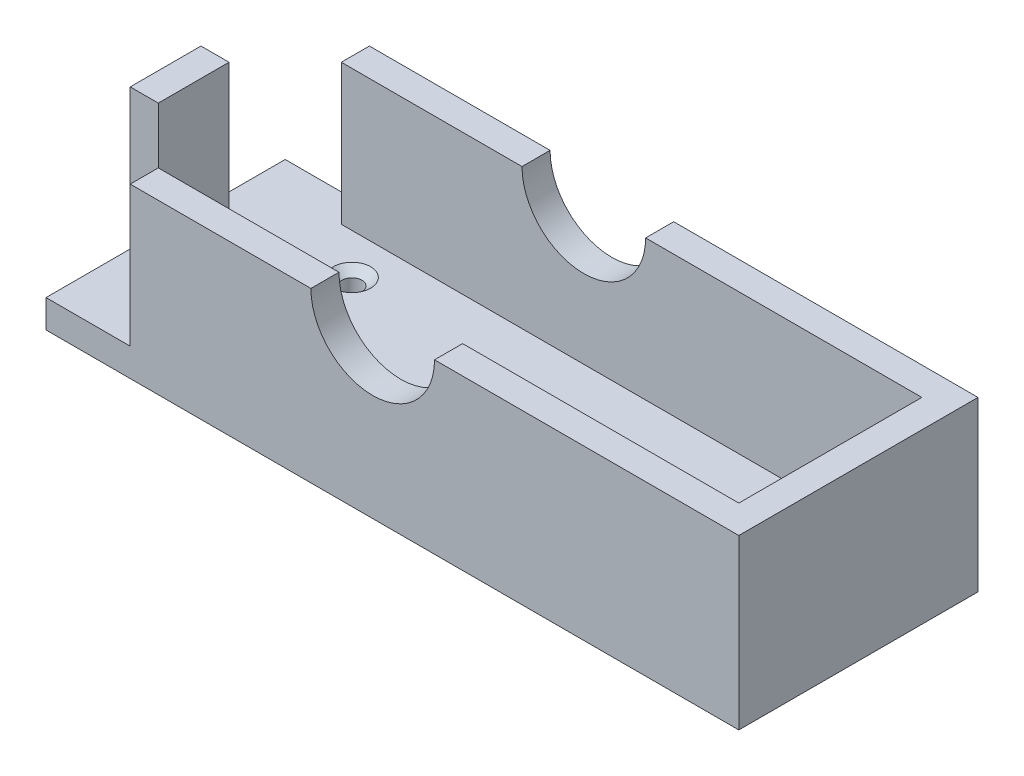
ISO-10303-21;
HEADER;
FILE_DESCRIPTION(('STEP AP214'),'2;1');
FILE_NAME('part.step','',(''),(''),'','','');
FILE_SCHEMA(('AUTOMOTIVE_DESIGN { 1 0 10303 214 1 1 1 1 }'));
ENDSEC;
DATA;
#1=APPLICATION_CONTEXT('core data for automotive mechanical design processes');
#2=APPLICATION_PROTOCOL_DEFINITION('international standard','automotive_design',2000,#1);
#3=PRODUCT_CONTEXT('',#1,'mechanical');
#4=PRODUCT('Part','Part','',(#3));
#5=PRODUCT_RELATED_PRODUCT_CATEGORY('part','',(#4));
#6=PRODUCT_DEFINITION_FORMATION('','',#4);
#7=PRODUCT_DEFINITION_CONTEXT('part definition',#1,'design');
#8=PRODUCT_DEFINITION('design','',#6,#7);
#9=PRODUCT_DEFINITION_SHAPE('','',#8);
#10=(LENGTH_UNIT() NAMED_UNIT(*) SI_UNIT(.MILLI.,.METRE.));
#11=(NAMED_UNIT(*) PLANE_ANGLE_UNIT() SI_UNIT($,.RADIAN.));
#12=(NAMED_UNIT(*) SI_UNIT($,.STERADIAN.) SOLID_ANGLE_UNIT());
#13=UNCERTAINTY_MEASURE_WITH_UNIT(LENGTH_MEASURE(1.E-05),#10,'distance_accuracy_value','');
#14=(GEOMETRIC_REPRESENTATION_CONTEXT(3) GLOBAL_UNCERTAINTY_ASSIGNED_CONTEXT((#13)) GLOBAL_UNIT_ASSIGNED_CONTEXT((#10,
#11,#12)) REPRESENTATION_CONTEXT('',''));
#15=CARTESIAN_POINT('',(0.,0.,0.));
#16=DIRECTION('',(0.,0.,1.));
#17=DIRECTION('',(1.,0.,0.));
#18=AXIS2_PLACEMENT_3D('',#15,#16,#17);
#19=CARTESIAN_POINT('',(0.,38.1,0.));
#20=DIRECTION('',(0.,1.,0.));
#21=DIRECTION('',(0.,0.,1.));
#22=AXIS2_PLACEMENT_3D('',#19,#20,#21);
#23=PLANE('',#22);
#24=DIRECTION('',(1.,0.,0.));
#25=VECTOR('',#24,1.);
#26=CARTESIAN_POINT('',(0.,38.1,37.6221782178218));
#27=LINE('',#26,#25);
#28=CARTESIAN_POINT('',(-56.7554506835294,38.1,37.6221782178218));
#29=VERTEX_POINT('',#28);
#30=CARTESIAN_POINT('',(-15.8863556331834,38.1,37.6221782178218));
#31=VERTEX_POINT('',#30);
#32=EDGE_CURVE('E344',#29,#31,#27,.T.);
#33=ORIENTED_EDGE('',*,*,#32,.T.);
#34=DIRECTION('',(0.,0.,-1.));
#35=VECTOR('',#34,1.);
#36=CARTESIAN_POINT('',(-15.8863556331834,38.1,258.203629195742));
#37=LINE('',#36,#35);
#38=CARTESIAN_POINT('',(-15.8863556331834,38.1,31.2721782178218));
#39=VERTEX_POINT('',#38);
#40=EDGE_CURVE('E222',#31,#39,#37,.T.);
#41=ORIENTED_EDGE('',*,*,#40,.T.);
#42=DIRECTION('',(1.,0.,0.));
#43=VECTOR('',#42,1.);
#44=CARTESIAN_POINT('',(0.,38.1,31.2721782178218));
#45=LINE('',#44,#43);
#46=CARTESIAN_POINT('',(-56.7554506835294,38.1,31.2721782178218));
#47=VERTEX_POINT('',#46);
#48=EDGE_CURVE('E280',#47,#39,#45,.T.);
#49=ORIENTED_EDGE('',*,*,#48,.F.);
#50=DIRECTION('',(0.,0.,1.));
#51=VECTOR('',#50,1.);
#52=CARTESIAN_POINT('',(-56.7554506835295,38.1,0.));
#53=LINE('',#52,#51);
#54=EDGE_CURVE('E283',#47,#29,#53,.T.);
#55=ORIENTED_EDGE('',*,*,#54,.T.);
#56=EDGE_LOOP('',(#33,#41,#49,#55));
#57=FACE_BOUND('',#56,.T.);
#58=ADVANCED_FACE('F64',(#57),#23,.T.);
#59=DIRECTION('',(1.,0.,0.));
#60=VECTOR('',#59,1.);
#61=CARTESIAN_POINT('',(0.,38.1,-10.1298217821782));
#62=LINE('',#61,#60);
#63=CARTESIAN_POINT('',(-56.7554506835294,38.1,-10.1298217821782));
#64=VERTEX_POINT('',#63);
#65=CARTESIAN_POINT('',(-15.8863556331834,38.1,-10.1298217821782));
#66=VERTEX_POINT('',#65);
#67=EDGE_CURVE('E297',#64,#66,#62,.T.);
#68=ORIENTED_EDGE('',*,*,#67,.T.);
#69=CARTESIAN_POINT('',(-15.8863556331834,38.1,-16.4798217821782));
#70=VERTEX_POINT('',#69);
#71=EDGE_CURVE('E201',#66,#70,#37,.T.);
#72=ORIENTED_EDGE('',*,*,#71,.T.);
#73=DIRECTION('',(1.,0.,0.));
#74=VECTOR('',#73,1.);
#75=CARTESIAN_POINT('',(0.,38.1,-16.4798217821782));
#76=LINE('',#75,#74);
#77=CARTESIAN_POINT('',(-56.7554506835294,38.1,-16.4798217821782));
#78=VERTEX_POINT('',#77);
#79=EDGE_CURVE('E351',#78,#70,#76,.T.);
#80=ORIENTED_EDGE('',*,*,#79,.F.);
#81=DIRECTION('',(0.,0.,1.));
#82=VECTOR('',#81,1.);
#83=CARTESIAN_POINT('',(-56.7554506835294,38.1,0.));
#84=LINE('',#83,#82);
#85=EDGE_CURVE('E294',#78,#64,#84,.T.);
#86=ORIENTED_EDGE('',*,*,#85,.T.);
#87=EDGE_LOOP('',(#68,#72,#80,#86));
#88=FACE_BOUND('',#87,.T.);
#89=ADVANCED_FACE('F401',(#88),#23,.T.);
#90=CARTESIAN_POINT('',(74.5625493164706,38.1,0.));
#91=DIRECTION('',(1.,0.,0.));
#92=DIRECTION('',(0.,0.,-1.));
#93=AXIS2_PLACEMENT_3D('',#90,#91,#92);
#94=PLANE('',#93);
#95=DIRECTION('',(0.,0.,1.));
#96=VECTOR('',#95,1.);
#97=CARTESIAN_POINT('',(74.5625493164706,6.35,0.));
#98=LINE('',#97,#96);
#99=CARTESIAN_POINT('',(74.5625493164706,6.35000000000002,-10.1298217821782));
#100=VERTEX_POINT('',#99);
#101=CARTESIAN_POINT('',(74.5625493164706,6.35,31.2721782178218));
#102=VERTEX_POINT('',#101);
#103=EDGE_CURVE('E327',#100,#102,#98,.T.);
#104=ORIENTED_EDGE('',*,*,#103,.T.);
#105=DIRECTION('',(0.,-1.,0.));
#106=VECTOR('',#105,1.);
#107=CARTESIAN_POINT('',(74.5625493164706,38.1,31.2721782178218));
#108=LINE('',#107,#106);
#109=CARTESIAN_POINT('',(74.5625493164706,38.1,31.2721782178218));
#110=VERTEX_POINT('',#109);
#111=EDGE_CURVE('E286',#110,#102,#108,.T.);
#112=ORIENTED_EDGE('',*,*,#111,.F.);
#113=DIRECTION('',(0.,0.,1.));
#114=VECTOR('',#113,1.);
#115=CARTESIAN_POINT('',(74.5625493164706,38.1,0.));
#116=LINE('',#115,#114);
#117=CARTESIAN_POINT('',(74.5625493164706,38.1,-10.1298217821782));
#118=VERTEX_POINT('',#117);
#119=EDGE_CURVE('E340',#118,#110,#116,.T.);
#120=ORIENTED_EDGE('',*,*,#119,.F.);
#121=DIRECTION('',(0.,-1.,0.));
#122=VECTOR('',#121,1.);
#123=CARTESIAN_POINT('',(74.5625493164706,38.1,-10.1298217821782));
#124=LINE('',#123,#122);
#125=EDGE_CURVE('E300',#118,#100,#124,.T.);
#126=ORIENTED_EDGE('',*,*,#125,.T.);
#127=EDGE_LOOP('',(#104,#112,#120,#126));
#128=FACE_BOUND('',#127,.T.);
#129=ADVANCED_FACE('F66',(#128),#94,.F.);
#130=CARTESIAN_POINT('',(0.,38.1,37.6221782178218));
#131=DIRECTION('',(0.,0.,-1.));
#132=DIRECTION('',(-1.,0.,0.));
#133=AXIS2_PLACEMENT_3D('',#130,#131,#132);
#134=PLANE('',#133);
#135=CARTESIAN_POINT('',(-1.90390315835642,38.1,37.6221782178218));
#136=DIRECTION('',(0.,0.,-1.));
#137=DIRECTION('',(-1.,0.,0.));
#138=AXIS2_PLACEMENT_3D('',#135,#136,#137);
#139=CIRCLE('',#138,13.982452474827);
#140=CARTESIAN_POINT('',(12.0785493164706,38.1,37.6221782178218));
#141=VERTEX_POINT('',#140);
#142=EDGE_CURVE('E229',#31,#141,#139,.F.);
#143=ORIENTED_EDGE('',*,*,#142,.F.);
#144=ORIENTED_EDGE('',*,*,#32,.F.);
#145=DIRECTION('',(0.,-1.,0.));
#146=VECTOR('',#145,1.);
#147=CARTESIAN_POINT('',(-56.7554506835294,38.1,37.6221782178218));
#148=LINE('',#147,#146);
#149=CARTESIAN_POINT('',(-56.7554506835294,6.35000000000002,37.6221782178218));
#150=VERTEX_POINT('',#149);
#151=EDGE_CURVE('E288',#29,#150,#148,.T.);
#152=ORIENTED_EDGE('',*,*,#151,.T.);
#153=DIRECTION('',(1.,0.,0.));
#154=VECTOR('',#153,1.);
#155=CARTESIAN_POINT('',(0.,6.35,37.6221782178218));
#156=LINE('',#155,#154);
#157=CARTESIAN_POINT('',(-75.8054506835294,6.35,37.6221782178218));
#158=VERTEX_POINT('',#157);
#159=EDGE_CURVE('E235',#158,#150,#156,.T.);
#160=ORIENTED_EDGE('',*,*,#159,.F.);
#161=DIRECTION('',(0.,-1.,0.));
#162=VECTOR('',#161,1.);
#163=CARTESIAN_POINT('',(-75.8054506835294,6.35,37.6221782178218));
#164=LINE('',#163,#162);
#165=CARTESIAN_POINT('',(-75.8054506835294,0.,37.6221782178218));
#166=VERTEX_POINT('',#165);
#167=EDGE_CURVE('E240',#158,#166,#164,.T.);
#168=ORIENTED_EDGE('',*,*,#167,.T.);
#169=DIRECTION('',(1.,0.,0.));
#170=VECTOR('',#169,1.);
#171=CARTESIAN_POINT('',(0.,0.,37.6221782178218));
#172=LINE('',#171,#170);
#173=CARTESIAN_POINT('',(80.9125493164706,0.,37.6221782178218));
#174=VERTEX_POINT('',#173);
#175=EDGE_CURVE('E339',#166,#174,#172,.T.);
#176=ORIENTED_EDGE('',*,*,#175,.T.);
#177=DIRECTION('',(0.,-1.,0.));
#178=VECTOR('',#177,1.);
#179=CARTESIAN_POINT('',(80.9125493164706,38.1,37.6221782178218));
#180=LINE('',#179,#178);
#181=CARTESIAN_POINT('',(80.9125493164706,38.1,37.6221782178218));
#182=VERTEX_POINT('',#181);
#183=EDGE_CURVE('E72',#182,#174,#180,.T.);
#184=ORIENTED_EDGE('',*,*,#183,.F.);
#185=EDGE_CURVE('E343',#141,#182,#27,.T.);
#186=ORIENTED_EDGE('',*,*,#185,.F.);
#187=EDGE_LOOP('',(#143,#144,#152,#160,#168,#176,#184,#186));
#188=FACE_BOUND('',#187,.T.);
#189=ADVANCED_FACE('F370',(#188),#134,.F.);
#190=CARTESIAN_POINT('',(80.9125493164706,38.1,0.));
#191=DIRECTION('',(1.,0.,0.));
#192=DIRECTION('',(0.,0.,-1.));
#193=AXIS2_PLACEMENT_3D('',#190,#191,#192);
#194=PLANE('',#193);
#195=DIRECTION('',(0.,0.,1.));
#196=VECTOR('',#195,1.);
#197=CARTESIAN_POINT('',(80.9125493164706,0.,0.));
#198=LINE('',#197,#196);
#199=CARTESIAN_POINT('',(80.9125493164706,0.,-16.4798217821782));
#200=VERTEX_POINT('',#199);
#201=EDGE_CURVE('E356',#200,#174,#198,.T.);
#202=ORIENTED_EDGE('',*,*,#201,.F.);
#203=DIRECTION('',(0.,-1.,0.));
#204=VECTOR('',#203,1.);
#205=CARTESIAN_POINT('',(80.9125493164706,38.1,-16.4798217821782));
#206=LINE('',#205,#204);
#207=CARTESIAN_POINT('',(80.9125493164706,38.1,-16.4798217821782));
#208=VERTEX_POINT('',#207);
#209=EDGE_CURVE('E353',#208,#200,#206,.T.);
#210=ORIENTED_EDGE('',*,*,#209,.F.);
#211=DIRECTION('',(0.,0.,1.));
#212=VECTOR('',#211,1.);
#213=CARTESIAN_POINT('',(80.9125493164706,38.1,0.));
#214=LINE('',#213,#212);
#215=EDGE_CURVE('E347',#208,#182,#214,.T.);
#216=ORIENTED_EDGE('',*,*,#215,.T.);
#217=ORIENTED_EDGE('',*,*,#183,.T.);
#218=EDGE_LOOP('',(#202,#210,#216,#217));
#219=FACE_BOUND('',#218,.T.);
#220=ADVANCED_FACE('F363',(#219),#194,.T.);
#221=CARTESIAN_POINT('',(0.,38.1,-16.4798217821782));
#222=DIRECTION('',(0.,0.,-1.));
#223=DIRECTION('',(-1.,0.,0.));
#224=AXIS2_PLACEMENT_3D('',#221,#222,#223);
#225=PLANE('',#224);
#226=ORIENTED_EDGE('',*,*,#79,.T.);
#227=CARTESIAN_POINT('',(-1.90390315835642,38.1,-16.4798217821782));
#228=DIRECTION('',(0.,0.,-1.));
#229=DIRECTION('',(-1.,0.,0.));
#230=AXIS2_PLACEMENT_3D('',#227,#228,#229);
#231=CIRCLE('',#230,13.982452474827);
#232=CARTESIAN_POINT('',(12.0785493164706,38.1,-16.4798217821782));
#233=VERTEX_POINT('',#232);
#234=EDGE_CURVE('E227',#70,#233,#231,.F.);
#235=ORIENTED_EDGE('',*,*,#234,.T.);
#236=EDGE_CURVE('E350',#233,#208,#76,.T.);
#237=ORIENTED_EDGE('',*,*,#236,.T.);
#238=ORIENTED_EDGE('',*,*,#209,.T.);
#239=DIRECTION('',(1.,0.,0.));
#240=VECTOR('',#239,1.);
#241=CARTESIAN_POINT('',(0.,0.,-16.4798217821782));
#242=LINE('',#241,#240);
#243=CARTESIAN_POINT('',(-75.8054506835294,0.,-16.4798217821782));
#244=VERTEX_POINT('',#243);
#245=EDGE_CURVE('E199',#244,#200,#242,.T.);
#246=ORIENTED_EDGE('',*,*,#245,.F.);
#247=DIRECTION('',(0.,-1.,0.));
#248=VECTOR('',#247,1.);
#249=CARTESIAN_POINT('',(-75.8054506835294,6.35,-16.4798217821782));
#250=LINE('',#249,#248);
#251=CARTESIAN_POINT('',(-75.8054506835294,6.35,-16.4798217821782));
#252=VERTEX_POINT('',#251);
#253=EDGE_CURVE('E192',#252,#244,#250,.T.);
#254=ORIENTED_EDGE('',*,*,#253,.F.);
#255=DIRECTION('',(1.,0.,0.));
#256=VECTOR('',#255,1.);
#257=CARTESIAN_POINT('',(0.,6.35,-16.4798217821782));
#258=LINE('',#257,#256);
#259=CARTESIAN_POINT('',(-56.7554506835294,6.35000000000002,-16.4798217821782));
#260=VERTEX_POINT('',#259);
#261=EDGE_CURVE('E197',#252,#260,#258,.T.);
#262=ORIENTED_EDGE('',*,*,#261,.T.);
#263=DIRECTION('',(0.,-1.,0.));
#264=VECTOR('',#263,1.);
#265=CARTESIAN_POINT('',(-56.7554506835294,38.1,-16.4798217821782));
#266=LINE('',#265,#264);
#267=EDGE_CURVE('E87',#78,#260,#266,.T.);
#268=ORIENTED_EDGE('',*,*,#267,.F.);
#269=EDGE_LOOP('',(#226,#235,#237,#238,#246,#254,#262,#268));
#270=FACE_BOUND('',#269,.T.);
#271=ADVANCED_FACE('F195',(#270),#225,.T.);
#272=DIRECTION('',(0.,0.,-1.));
#273=VECTOR('',#272,1.);
#274=CARTESIAN_POINT('',(12.0785493164706,38.1,258.203629195742));
#275=LINE('',#274,#273);
#276=CARTESIAN_POINT('',(12.0785493164706,38.1,31.2721782178218));
#277=VERTEX_POINT('',#276);
#278=EDGE_CURVE('E221',#141,#277,#275,.T.);
#279=ORIENTED_EDGE('',*,*,#278,.F.);
#280=ORIENTED_EDGE('',*,*,#185,.T.);
#281=ORIENTED_EDGE('',*,*,#215,.F.);
#282=ORIENTED_EDGE('',*,*,#236,.F.);
#283=CARTESIAN_POINT('',(12.0785493164706,38.1,-10.1298217821782));
#284=VERTEX_POINT('',#283);
#285=EDGE_CURVE('E218',#284,#233,#275,.T.);
#286=ORIENTED_EDGE('',*,*,#285,.F.);
#287=EDGE_CURVE('E296',#284,#118,#62,.T.);
#288=ORIENTED_EDGE('',*,*,#287,.T.);
#289=ORIENTED_EDGE('',*,*,#119,.T.);
#290=EDGE_CURVE('E279',#277,#110,#45,.T.);
#291=ORIENTED_EDGE('',*,*,#290,.F.);
#292=EDGE_LOOP('',(#279,#280,#281,#282,#286,#288,#289,#291));
#293=FACE_BOUND('',#292,.T.);
#294=ADVANCED_FACE('F404',(#293),#23,.T.);
#295=CARTESIAN_POINT('',(0.,0.,0.));
#296=DIRECTION('',(0.,1.,0.));
#297=DIRECTION('',(0.,0.,1.));
#298=AXIS2_PLACEMENT_3D('',#295,#296,#297);
#299=PLANE('',#298);
#300=CARTESIAN_POINT('',(-45.1349506835294,0.,21.9376782178218));
#301=DIRECTION('',(0.,1.,0.));
#302=DIRECTION('',(0.,0.,1.));
#303=AXIS2_PLACEMENT_3D('',#300,#301,#302);
#304=CIRCLE('',#303,2.2479);
#305=CARTESIAN_POINT('',(-45.1349506835294,0.,24.1855782178218));
#306=VERTEX_POINT('',#305);
#307=EDGE_CURVE('E249',#306,#306,#304,.T.);
#308=ORIENTED_EDGE('',*,*,#307,.T.);
#309=EDGE_LOOP('',(#308));
#310=FACE_BOUND('',#309,.T.);
#311=CARTESIAN_POINT('',(-45.1349506835295,0.,-0.922321782178217));
#312=DIRECTION('',(0.,1.,0.));
#313=DIRECTION('',(0.,0.,1.));
#314=AXIS2_PLACEMENT_3D('',#311,#312,#313);
#315=CIRCLE('',#314,2.2479);
#316=CARTESIAN_POINT('',(-45.1349506835295,0.,1.32557821782178));
#317=VERTEX_POINT('',#316);
#318=EDGE_CURVE('E258',#317,#317,#315,.T.);
#319=ORIENTED_EDGE('',*,*,#318,.T.);
#320=EDGE_LOOP('',(#319));
#321=FACE_BOUND('',#320,.T.);
#322=CARTESIAN_POINT('',(50.1150493164705,0.,-0.858821782178217));
#323=DIRECTION('',(0.,1.,0.));
#324=DIRECTION('',(0.,0.,1.));
#325=AXIS2_PLACEMENT_3D('',#322,#323,#324);
#326=CIRCLE('',#325,2.2479);
#327=CARTESIAN_POINT('',(50.1150493164705,0.,1.38907821782178));
#328=VERTEX_POINT('',#327);
#329=EDGE_CURVE('E267',#328,#328,#326,.T.);
#330=ORIENTED_EDGE('',*,*,#329,.T.);
#331=EDGE_LOOP('',(#330));
#332=FACE_BOUND('',#331,.T.);
#333=CARTESIAN_POINT('',(50.1150493164706,0.,22.0011782178218));
#334=DIRECTION('',(0.,1.,0.));
#335=DIRECTION('',(0.,0.,1.));
#336=AXIS2_PLACEMENT_3D('',#333,#334,#335);
#337=CIRCLE('',#336,2.2479);
#338=CARTESIAN_POINT('',(50.1150493164706,0.,24.2490782178218));
#339=VERTEX_POINT('',#338);
#340=EDGE_CURVE('E276',#339,#339,#337,.T.);
#341=ORIENTED_EDGE('',*,*,#340,.T.);
#342=EDGE_LOOP('',(#341));
#343=FACE_BOUND('',#342,.T.);
#344=ORIENTED_EDGE('',*,*,#175,.F.);
#345=DIRECTION('',(0.,0.,1.));
#346=VECTOR('',#345,1.);
#347=CARTESIAN_POINT('',(-75.8054506835294,0.,0.));
#348=LINE('',#347,#346);
#349=EDGE_CURVE('E307',#244,#166,#348,.T.);
#350=ORIENTED_EDGE('',*,*,#349,.F.);
#351=ORIENTED_EDGE('',*,*,#245,.T.);
#352=ORIENTED_EDGE('',*,*,#201,.T.);
#353=EDGE_LOOP('',(#344,#350,#351,#352));
#354=FACE_BOUND('',#353,.T.);
#355=ADVANCED_FACE('F374',(#310,#321,#332,#343,#354),#299,.F.);
#356=CARTESIAN_POINT('',(0.,6.35,0.));
#357=DIRECTION('',(0.,1.,0.));
#358=DIRECTION('',(0.,0.,1.));
#359=AXIS2_PLACEMENT_3D('',#356,#357,#358);
#360=PLANE('',#359);
#361=DIRECTION('',(1.,0.,0.));
#362=VECTOR('',#361,1.);
#363=CARTESIAN_POINT('',(0.,6.35,2.57017821782178));
#364=LINE('',#363,#362);
#365=CARTESIAN_POINT('',(-75.8054506835294,6.35000000000002,2.57017821782178));
#366=VERTEX_POINT('',#365);
#367=CARTESIAN_POINT('',(-69.4554506835294,6.35000000000003,2.57017821782178));
#368=VERTEX_POINT('',#367);
#369=EDGE_CURVE('E79',#366,#368,#364,.T.);
#370=ORIENTED_EDGE('',*,*,#369,.T.);
#371=DIRECTION('',(0.,0.,1.));
#372=VECTOR('',#371,1.);
#373=CARTESIAN_POINT('',(-69.4554506835294,6.35,0.));
#374=LINE('',#373,#372);
#375=CARTESIAN_POINT('',(-69.4554506835294,6.35000000000003,18.5721782178218));
#376=VERTEX_POINT('',#375);
#377=EDGE_CURVE('E333',#368,#376,#374,.T.);
#378=ORIENTED_EDGE('',*,*,#377,.T.);
#379=DIRECTION('',(1.,0.,0.));
#380=VECTOR('',#379,1.);
#381=CARTESIAN_POINT('',(0.,6.35,18.5721782178218));
#382=LINE('',#381,#380);
#383=CARTESIAN_POINT('',(-75.8054506835294,6.35000000000002,18.5721782178218));
#384=VERTEX_POINT('',#383);
#385=EDGE_CURVE('E231',#384,#376,#382,.T.);
#386=ORIENTED_EDGE('',*,*,#385,.F.);
#387=DIRECTION('',(0.,0.,1.));
#388=VECTOR('',#387,1.);
#389=CARTESIAN_POINT('',(-75.8054506835294,6.35,0.));
#390=LINE('',#389,#388);
#391=EDGE_CURVE('E233',#384,#158,#390,.T.);
#392=ORIENTED_EDGE('',*,*,#391,.T.);
#393=ORIENTED_EDGE('',*,*,#159,.T.);
#394=DIRECTION('',(0.,0.,1.));
#395=VECTOR('',#394,1.);
#396=CARTESIAN_POINT('',(-56.7554506835295,6.35,0.));
#397=LINE('',#396,#395);
#398=CARTESIAN_POINT('',(-56.7554506835294,6.35000000000002,31.2721782178218));
#399=VERTEX_POINT('',#398);
#400=EDGE_CURVE('E238',#399,#150,#397,.T.);
#401=ORIENTED_EDGE('',*,*,#400,.F.);
#402=DIRECTION('',(1.,0.,0.));
#403=VECTOR('',#402,1.);
#404=CARTESIAN_POINT('',(0.,6.35,31.2721782178218));
#405=LINE('',#404,#403);
#406=EDGE_CURVE('E336',#399,#102,#405,.T.);
#407=ORIENTED_EDGE('',*,*,#406,.T.);
#408=ORIENTED_EDGE('',*,*,#103,.F.);
#409=DIRECTION('',(1.,0.,0.));
#410=VECTOR('',#409,1.);
#411=CARTESIAN_POINT('',(0.,6.35,-10.1298217821782));
#412=LINE('',#411,#410);
#413=CARTESIAN_POINT('',(-56.7554506835294,6.35,-10.1298217821782));
#414=VERTEX_POINT('',#413);
#415=EDGE_CURVE('E330',#414,#100,#412,.T.);
#416=ORIENTED_EDGE('',*,*,#415,.F.);
#417=DIRECTION('',(0.,0.,1.));
#418=VECTOR('',#417,1.);
#419=CARTESIAN_POINT('',(-56.7554506835294,6.35,0.));
#420=LINE('',#419,#418);
#421=EDGE_CURVE('E213',#260,#414,#420,.T.);
#422=ORIENTED_EDGE('',*,*,#421,.F.);
#423=ORIENTED_EDGE('',*,*,#261,.F.);
#424=DIRECTION('',(0.,0.,1.));
#425=VECTOR('',#424,1.);
#426=CARTESIAN_POINT('',(-75.8054506835294,6.35,0.));
#427=LINE('',#426,#425);
#428=EDGE_CURVE('E204',#252,#366,#427,.T.);
#429=ORIENTED_EDGE('',*,*,#428,.T.);
#430=EDGE_LOOP('',(#370,#378,#386,#392,#393,#401,#407,#408,#416,#422,#423,#429));
#431=FACE_BOUND('',#430,.T.);
#432=CARTESIAN_POINT('',(-45.1349506835294,6.35,21.9376782178218));
#433=DIRECTION('',(0.,1.,0.));
#434=DIRECTION('',(0.,0.,1.));
#435=AXIS2_PLACEMENT_3D('',#432,#433,#434);
#436=CIRCLE('',#435,4.2164);
#437=CARTESIAN_POINT('',(-45.1349506835294,6.35,26.1540782178218));
#438=VERTEX_POINT('',#437);
#439=EDGE_CURVE('E243',#438,#438,#436,.T.);
#440=ORIENTED_EDGE('',*,*,#439,.F.);
#441=EDGE_LOOP('',(#440));
#442=FACE_BOUND('',#441,.T.);
#443=CARTESIAN_POINT('',(-45.1349506835295,6.35,-0.922321782178217));
#444=DIRECTION('',(0.,1.,0.));
#445=DIRECTION('',(0.,0.,1.));
#446=AXIS2_PLACEMENT_3D('',#443,#444,#445);
#447=CIRCLE('',#446,4.2164);
#448=CARTESIAN_POINT('',(-45.1349506835295,6.35,3.29407821782179));
#449=VERTEX_POINT('',#448);
#450=EDGE_CURVE('E252',#449,#449,#447,.T.);
#451=ORIENTED_EDGE('',*,*,#450,.F.);
#452=EDGE_LOOP('',(#451));
#453=FACE_BOUND('',#452,.T.);
#454=CARTESIAN_POINT('',(50.1150493164705,6.35,-0.858821782178217));
#455=DIRECTION('',(0.,1.,0.));
#456=DIRECTION('',(0.,0.,1.));
#457=AXIS2_PLACEMENT_3D('',#454,#455,#456);
#458=CIRCLE('',#457,4.2164);
#459=CARTESIAN_POINT('',(50.1150493164705,6.35,3.35757821782178));
#460=VERTEX_POINT('',#459);
#461=EDGE_CURVE('E261',#460,#460,#458,.T.);
#462=ORIENTED_EDGE('',*,*,#461,.F.);
#463=EDGE_LOOP('',(#462));
#464=FACE_BOUND('',#463,.T.);
#465=CARTESIAN_POINT('',(50.1150493164706,6.35,22.0011782178218));
#466=DIRECTION('',(0.,1.,0.));
#467=DIRECTION('',(0.,0.,1.));
#468=AXIS2_PLACEMENT_3D('',#465,#466,#467);
#469=CIRCLE('',#468,4.2164);
#470=CARTESIAN_POINT('',(50.1150493164706,6.35,26.2175782178218));
#471=VERTEX_POINT('',#470);
#472=EDGE_CURVE('E270',#471,#471,#469,.T.);
#473=ORIENTED_EDGE('',*,*,#472,.F.);
#474=EDGE_LOOP('',(#473));
#475=FACE_BOUND('',#474,.T.);
#476=ADVANCED_FACE('F210',(#431,#442,#453,#464,#475),#360,.T.);
#477=CARTESIAN_POINT('',(-69.4554506835294,38.1,0.));
#478=DIRECTION('',(1.,0.,0.));
#479=DIRECTION('',(0.,0.,-1.));
#480=AXIS2_PLACEMENT_3D('',#477,#478,#479);
#481=PLANE('',#480);
#482=ORIENTED_EDGE('',*,*,#377,.F.);
#483=DIRECTION('',(0.,-1.,0.));
#484=VECTOR('',#483,1.);
#485=CARTESIAN_POINT('',(-69.4554506835294,38.1,2.57017821782178));
#486=LINE('',#485,#484);
#487=CARTESIAN_POINT('',(-69.4554506835294,38.1,2.57017821782178));
#488=VERTEX_POINT('',#487);
#489=EDGE_CURVE('E318',#488,#368,#486,.T.);
#490=ORIENTED_EDGE('',*,*,#489,.F.);
#491=DIRECTION('',(0.,0.,1.));
#492=VECTOR('',#491,1.);
#493=CARTESIAN_POINT('',(-69.4554506835294,38.1,0.));
#494=LINE('',#493,#492);
#495=CARTESIAN_POINT('',(-69.4554506835294,38.1,18.5721782178218));
#496=VERTEX_POINT('',#495);
#497=EDGE_CURVE('E315',#488,#496,#494,.T.);
#498=ORIENTED_EDGE('',*,*,#497,.T.);
#499=DIRECTION('',(0.,-1.,0.));
#500=VECTOR('',#499,1.);
#501=CARTESIAN_POINT('',(-69.4554506835294,38.1,18.5721782178218));
#502=LINE('',#501,#500);
#503=EDGE_CURVE('E321',#496,#376,#502,.T.);
#504=ORIENTED_EDGE('',*,*,#503,.T.);
#505=EDGE_LOOP('',(#482,#490,#498,#504));
#506=FACE_BOUND('',#505,.T.);
#507=ADVANCED_FACE('F385',(#506),#481,.T.);
#508=CARTESIAN_POINT('',(0.,38.1,2.57017821782178));
#509=DIRECTION('',(0.,0.,-1.));
#510=DIRECTION('',(-1.,0.,0.));
#511=AXIS2_PLACEMENT_3D('',#508,#509,#510);
#512=PLANE('',#511);
#513=ORIENTED_EDGE('',*,*,#369,.F.);
#514=DIRECTION('',(0.,-1.,0.));
#515=VECTOR('',#514,1.);
#516=CARTESIAN_POINT('',(-75.8054506835294,38.1,2.57017821782178));
#517=LINE('',#516,#515);
#518=CARTESIAN_POINT('',(-75.8054506835294,38.1,2.57017821782178));
#519=VERTEX_POINT('',#518);
#520=EDGE_CURVE('E207',#519,#366,#517,.T.);
#521=ORIENTED_EDGE('',*,*,#520,.F.);
#522=DIRECTION('',(1.,0.,0.));
#523=VECTOR('',#522,1.);
#524=CARTESIAN_POINT('',(0.,38.1,2.57017821782178));
#525=LINE('',#524,#523);
#526=EDGE_CURVE('E308',#519,#488,#525,.T.);
#527=ORIENTED_EDGE('',*,*,#526,.T.);
#528=ORIENTED_EDGE('',*,*,#489,.T.);
#529=EDGE_LOOP('',(#513,#521,#527,#528));
#530=FACE_BOUND('',#529,.T.);
#531=ADVANCED_FACE('F390',(#530),#512,.T.);
#532=CARTESIAN_POINT('',(-75.8054506835294,38.1,0.));
#533=DIRECTION('',(1.,0.,0.));
#534=DIRECTION('',(0.,0.,-1.));
#535=AXIS2_PLACEMENT_3D('',#532,#533,#534);
#536=PLANE('',#535);
#537=ORIENTED_EDGE('',*,*,#349,.T.);
#538=ORIENTED_EDGE('',*,*,#167,.F.);
#539=ORIENTED_EDGE('',*,*,#391,.F.);
#540=DIRECTION('',(0.,-1.,0.));
#541=VECTOR('',#540,1.);
#542=CARTESIAN_POINT('',(-75.8054506835294,38.1,18.5721782178218));
#543=LINE('',#542,#541);
#544=CARTESIAN_POINT('',(-75.8054506835294,38.1,18.5721782178218));
#545=VERTEX_POINT('',#544);
#546=EDGE_CURVE('E324',#545,#384,#543,.T.);
#547=ORIENTED_EDGE('',*,*,#546,.F.);
#548=DIRECTION('',(0.,0.,1.));
#549=VECTOR('',#548,1.);
#550=CARTESIAN_POINT('',(-75.8054506835294,38.1,0.));
#551=LINE('',#550,#549);
#552=EDGE_CURVE('E311',#519,#545,#551,.T.);
#553=ORIENTED_EDGE('',*,*,#552,.F.);
#554=ORIENTED_EDGE('',*,*,#520,.T.);
#555=ORIENTED_EDGE('',*,*,#428,.F.);
#556=ORIENTED_EDGE('',*,*,#253,.T.);
#557=EDGE_LOOP('',(#537,#538,#539,#547,#553,#554,#555,#556));
#558=FACE_BOUND('',#557,.T.);
#559=ADVANCED_FACE('F205',(#558),#536,.F.);
#560=CARTESIAN_POINT('',(0.,38.1,18.5721782178218));
#561=DIRECTION('',(0.,0.,-1.));
#562=DIRECTION('',(-1.,0.,0.));
#563=AXIS2_PLACEMENT_3D('',#560,#561,#562);
#564=PLANE('',#563);
#565=ORIENTED_EDGE('',*,*,#546,.T.);
#566=ORIENTED_EDGE('',*,*,#385,.T.);
#567=ORIENTED_EDGE('',*,*,#503,.F.);
#568=DIRECTION('',(1.,0.,0.));
#569=VECTOR('',#568,1.);
#570=CARTESIAN_POINT('',(0.,38.1,18.5721782178218));
#571=LINE('',#570,#569);
#572=EDGE_CURVE('E313',#545,#496,#571,.T.);
#573=ORIENTED_EDGE('',*,*,#572,.F.);
#574=EDGE_LOOP('',(#565,#566,#567,#573));
#575=FACE_BOUND('',#574,.T.);
#576=ADVANCED_FACE('F382',(#575),#564,.F.);
#577=CARTESIAN_POINT('',(0.,38.1,0.));
#578=DIRECTION('',(0.,1.,0.));
#579=DIRECTION('',(0.,0.,1.));
#580=AXIS2_PLACEMENT_3D('',#577,#578,#579);
#581=PLANE('',#580);
#582=ORIENTED_EDGE('',*,*,#526,.F.);
#583=ORIENTED_EDGE('',*,*,#552,.T.);
#584=ORIENTED_EDGE('',*,*,#572,.T.);
#585=ORIENTED_EDGE('',*,*,#497,.F.);
#586=EDGE_LOOP('',(#582,#583,#584,#585));
#587=FACE_BOUND('',#586,.T.);
#588=ADVANCED_FACE('F389',(#587),#581,.T.);
#589=CARTESIAN_POINT('',(-56.7554506835294,38.1,0.));
#590=DIRECTION('',(1.,0.,0.));
#591=DIRECTION('',(0.,0.,-1.));
#592=AXIS2_PLACEMENT_3D('',#589,#590,#591);
#593=PLANE('',#592);
#594=ORIENTED_EDGE('',*,*,#267,.T.);
#595=ORIENTED_EDGE('',*,*,#421,.T.);
#596=DIRECTION('',(0.,-1.,0.));
#597=VECTOR('',#596,1.);
#598=CARTESIAN_POINT('',(-56.7554506835294,38.1,-10.1298217821782));
#599=LINE('',#598,#597);
#600=EDGE_CURVE('E303',#64,#414,#599,.T.);
#601=ORIENTED_EDGE('',*,*,#600,.F.);
#602=ORIENTED_EDGE('',*,*,#85,.F.);
#603=EDGE_LOOP('',(#594,#595,#601,#602));
#604=FACE_BOUND('',#603,.T.);
#605=ADVANCED_FACE('F436',(#604),#593,.F.);
#606=CARTESIAN_POINT('',(0.,38.1,-10.1298217821782));
#607=DIRECTION('',(0.,0.,-1.));
#608=DIRECTION('',(-1.,0.,0.));
#609=AXIS2_PLACEMENT_3D('',#606,#607,#608);
#610=PLANE('',#609);
#611=CARTESIAN_POINT('',(-1.90390315835642,38.1,-10.1298217821782));
#612=DIRECTION('',(0.,0.,-1.));
#613=DIRECTION('',(-1.,0.,0.));
#614=AXIS2_PLACEMENT_3D('',#611,#612,#613);
#615=CIRCLE('',#614,13.982452474827);
#616=EDGE_CURVE('E224',#66,#284,#615,.F.);
#617=ORIENTED_EDGE('',*,*,#616,.F.);
#618=ORIENTED_EDGE('',*,*,#67,.F.);
#619=ORIENTED_EDGE('',*,*,#600,.T.);
#620=ORIENTED_EDGE('',*,*,#415,.T.);
#621=ORIENTED_EDGE('',*,*,#125,.F.);
#622=ORIENTED_EDGE('',*,*,#287,.F.);
#623=EDGE_LOOP('',(#617,#618,#619,#620,#621,#622));
#624=FACE_BOUND('',#623,.T.);
#625=ADVANCED_FACE('F433',(#624),#610,.F.);
#626=CARTESIAN_POINT('',(0.,38.1,31.2721782178218));
#627=DIRECTION('',(0.,0.,-1.));
#628=DIRECTION('',(-1.,0.,0.));
#629=AXIS2_PLACEMENT_3D('',#626,#627,#628);
#630=PLANE('',#629);
#631=ORIENTED_EDGE('',*,*,#48,.T.);
#632=CARTESIAN_POINT('',(-1.90390315835642,38.1,31.2721782178218));
#633=DIRECTION('',(0.,0.,-1.));
#634=DIRECTION('',(-1.,0.,0.));
#635=AXIS2_PLACEMENT_3D('',#632,#633,#634);
#636=CIRCLE('',#635,13.982452474827);
#637=EDGE_CURVE('E12',#39,#277,#636,.F.);
#638=ORIENTED_EDGE('',*,*,#637,.T.);
#639=ORIENTED_EDGE('',*,*,#290,.T.);
#640=ORIENTED_EDGE('',*,*,#111,.T.);
#641=ORIENTED_EDGE('',*,*,#406,.F.);
#642=DIRECTION('',(0.,-1.,0.));
#643=VECTOR('',#642,1.);
#644=CARTESIAN_POINT('',(-56.7554506835294,38.1,31.2721782178218));
#645=LINE('',#644,#643);
#646=EDGE_CURVE('E291',#47,#399,#645,.T.);
#647=ORIENTED_EDGE('',*,*,#646,.F.);
#648=EDGE_LOOP('',(#631,#638,#639,#640,#641,#647));
#649=FACE_BOUND('',#648,.T.);
#650=ADVANCED_FACE('F427',(#649),#630,.T.);
#651=CARTESIAN_POINT('',(-56.7554506835295,38.1,0.));
#652=DIRECTION('',(1.,0.,0.));
#653=DIRECTION('',(0.,0.,-1.));
#654=AXIS2_PLACEMENT_3D('',#651,#652,#653);
#655=PLANE('',#654);
#656=ORIENTED_EDGE('',*,*,#646,.T.);
#657=ORIENTED_EDGE('',*,*,#400,.T.);
#658=ORIENTED_EDGE('',*,*,#151,.F.);
#659=ORIENTED_EDGE('',*,*,#54,.F.);
#660=EDGE_LOOP('',(#656,#657,#658,#659));
#661=FACE_BOUND('',#660,.T.);
#662=ADVANCED_FACE('F425',(#661),#655,.F.);
#663=CARTESIAN_POINT('',(50.1150493164706,6.35,22.0011782178218));
#664=DIRECTION('',(0.,1.,0.));
#665=DIRECTION('',(0.,0.,1.));
#666=AXIS2_PLACEMENT_3D('',#663,#664,#665);
#667=CYLINDRICAL_SURFACE('',#666,2.24789999999999);
#668=ORIENTED_EDGE('',*,*,#340,.F.);
#669=EDGE_LOOP('',(#668));
#670=FACE_BOUND('',#669,.T.);
#671=CARTESIAN_POINT('',(50.1150493164706,4.69823237602753,22.0011782178218));
#672=DIRECTION('',(0.,1.,0.));
#673=DIRECTION('',(0.,0.,1.));
#674=AXIS2_PLACEMENT_3D('',#671,#672,#673);
#675=CIRCLE('',#674,2.24789999999998);
#676=CARTESIAN_POINT('',(50.1150493164706,4.69823237602753,24.2490782178218));
#677=VERTEX_POINT('',#676);
#678=EDGE_CURVE('E273',#677,#677,#675,.T.);
#679=ORIENTED_EDGE('',*,*,#678,.T.);
#680=EDGE_LOOP('',(#679));
#681=FACE_BOUND('',#680,.T.);
#682=ADVANCED_FACE('F477',(#670,#681),#667,.F.);
#683=CARTESIAN_POINT('',(50.1150493164706,6.35,22.0011782178218));
#684=DIRECTION('',(0.,1.,0.));
#685=DIRECTION('',(0.,0.,1.));
#686=AXIS2_PLACEMENT_3D('',#683,#684,#685);
#687=CONICAL_SURFACE('',#686,4.2164,0.872664625997171);
#688=ORIENTED_EDGE('',*,*,#678,.F.);
#689=EDGE_LOOP('',(#688));
#690=FACE_BOUND('',#689,.T.);
#691=ORIENTED_EDGE('',*,*,#472,.T.);
#692=EDGE_LOOP('',(#691));
#693=FACE_BOUND('',#692,.T.);
#694=ADVANCED_FACE('F473',(#690,#693),#687,.F.);
#695=CARTESIAN_POINT('',(50.1150493164705,6.35,-0.858821782178217));
#696=DIRECTION('',(0.,1.,0.));
#697=DIRECTION('',(0.,0.,1.));
#698=AXIS2_PLACEMENT_3D('',#695,#696,#697);
#699=CYLINDRICAL_SURFACE('',#698,2.24789999999999);
#700=ORIENTED_EDGE('',*,*,#329,.F.);
#701=EDGE_LOOP('',(#700));
#702=FACE_BOUND('',#701,.T.);
#703=CARTESIAN_POINT('',(50.1150493164705,4.69823237602753,-0.858821782178217));
#704=DIRECTION('',(0.,1.,0.));
#705=DIRECTION('',(0.,0.,1.));
#706=AXIS2_PLACEMENT_3D('',#703,#704,#705);
#707=CIRCLE('',#706,2.24789999999998);
#708=CARTESIAN_POINT('',(50.1150493164705,4.69823237602753,1.38907821782177));
#709=VERTEX_POINT('',#708);
#710=EDGE_CURVE('E264',#709,#709,#707,.T.);
#711=ORIENTED_EDGE('',*,*,#710,.T.);
#712=EDGE_LOOP('',(#711));
#713=FACE_BOUND('',#712,.T.);
#714=ADVANCED_FACE('F469',(#702,#713),#699,.F.);
#715=CARTESIAN_POINT('',(50.1150493164705,6.35,-0.858821782178217));
#716=DIRECTION('',(0.,1.,0.));
#717=DIRECTION('',(0.,0.,1.));
#718=AXIS2_PLACEMENT_3D('',#715,#716,#717);
#719=CONICAL_SURFACE('',#718,4.2164,0.872664625997171);
#720=ORIENTED_EDGE('',*,*,#710,.F.);
#721=EDGE_LOOP('',(#720));
#722=FACE_BOUND('',#721,.T.);
#723=ORIENTED_EDGE('',*,*,#461,.T.);
#724=EDGE_LOOP('',(#723));
#725=FACE_BOUND('',#724,.T.);
#726=ADVANCED_FACE('F465',(#722,#725),#719,.F.);
#727=CARTESIAN_POINT('',(-45.1349506835295,6.35,-0.922321782178217));
#728=DIRECTION('',(0.,1.,0.));
#729=DIRECTION('',(0.,0.,1.));
#730=AXIS2_PLACEMENT_3D('',#727,#728,#729);
#731=CYLINDRICAL_SURFACE('',#730,2.24789999999999);
#732=ORIENTED_EDGE('',*,*,#318,.F.);
#733=EDGE_LOOP('',(#732));
#734=FACE_BOUND('',#733,.T.);
#735=CARTESIAN_POINT('',(-45.1349506835295,4.69823237602753,-0.922321782178217));
#736=DIRECTION('',(0.,1.,0.));
#737=DIRECTION('',(0.,0.,1.));
#738=AXIS2_PLACEMENT_3D('',#735,#736,#737);
#739=CIRCLE('',#738,2.24789999999998);
#740=CARTESIAN_POINT('',(-45.1349506835295,4.69823237602753,1.32557821782177));
#741=VERTEX_POINT('',#740);
#742=EDGE_CURVE('E255',#741,#741,#739,.T.);
#743=ORIENTED_EDGE('',*,*,#742,.T.);
#744=EDGE_LOOP('',(#743));
#745=FACE_BOUND('',#744,.T.);
#746=ADVANCED_FACE('F461',(#734,#745),#731,.F.);
#747=CARTESIAN_POINT('',(-45.1349506835295,6.35,-0.922321782178217));
#748=DIRECTION('',(0.,1.,0.));
#749=DIRECTION('',(0.,0.,1.));
#750=AXIS2_PLACEMENT_3D('',#747,#748,#749);
#751=CONICAL_SURFACE('',#750,4.2164,0.872664625997171);
#752=ORIENTED_EDGE('',*,*,#742,.F.);
#753=EDGE_LOOP('',(#752));
#754=FACE_BOUND('',#753,.T.);
#755=ORIENTED_EDGE('',*,*,#450,.T.);
#756=EDGE_LOOP('',(#755));
#757=FACE_BOUND('',#756,.T.);
#758=ADVANCED_FACE('F457',(#754,#757),#751,.F.);
#759=CARTESIAN_POINT('',(-45.1349506835294,6.35,21.9376782178218));
#760=DIRECTION('',(0.,1.,0.));
#761=DIRECTION('',(0.,0.,1.));
#762=AXIS2_PLACEMENT_3D('',#759,#760,#761);
#763=CYLINDRICAL_SURFACE('',#762,2.24789999999999);
#764=ORIENTED_EDGE('',*,*,#307,.F.);
#765=EDGE_LOOP('',(#764));
#766=FACE_BOUND('',#765,.T.);
#767=CARTESIAN_POINT('',(-45.1349506835294,4.69823237602753,21.9376782178218));
#768=DIRECTION('',(0.,1.,0.));
#769=DIRECTION('',(0.,0.,1.));
#770=AXIS2_PLACEMENT_3D('',#767,#768,#769);
#771=CIRCLE('',#770,2.24789999999999);
#772=CARTESIAN_POINT('',(-45.1349506835294,4.69823237602753,24.1855782178218));
#773=VERTEX_POINT('',#772);
#774=EDGE_CURVE('E246',#773,#773,#771,.T.);
#775=ORIENTED_EDGE('',*,*,#774,.T.);
#776=EDGE_LOOP('',(#775));
#777=FACE_BOUND('',#776,.T.);
#778=ADVANCED_FACE('F453',(#766,#777),#763,.F.);
#779=CARTESIAN_POINT('',(-45.1349506835294,6.35,21.9376782178218));
#780=DIRECTION('',(0.,1.,0.));
#781=DIRECTION('',(0.,0.,1.));
#782=AXIS2_PLACEMENT_3D('',#779,#780,#781);
#783=CONICAL_SURFACE('',#782,4.2164,0.872664625997169);
#784=ORIENTED_EDGE('',*,*,#774,.F.);
#785=EDGE_LOOP('',(#784));
#786=FACE_BOUND('',#785,.T.);
#787=ORIENTED_EDGE('',*,*,#439,.T.);
#788=EDGE_LOOP('',(#787));
#789=FACE_BOUND('',#788,.T.);
#790=ADVANCED_FACE('F449',(#786,#789),#783,.F.);
#791=CARTESIAN_POINT('',(-1.90390315835642,38.1,258.203629195742));
#792=DIRECTION('',(0.,0.,-1.));
#793=DIRECTION('',(-1.,0.,0.));
#794=AXIS2_PLACEMENT_3D('',#791,#792,#793);
#795=CYLINDRICAL_SURFACE('',#794,13.982452474827);
#796=ORIENTED_EDGE('',*,*,#40,.F.);
#797=ORIENTED_EDGE('',*,*,#142,.T.);
#798=ORIENTED_EDGE('',*,*,#278,.T.);
#799=ORIENTED_EDGE('',*,*,#637,.F.);
#800=EDGE_LOOP('',(#796,#797,#798,#799));
#801=FACE_BOUND('',#800,.T.);
#802=ADVANCED_FACE('F444',(#801),#795,.F.);
#803=ORIENTED_EDGE('',*,*,#234,.F.);
#804=ORIENTED_EDGE('',*,*,#71,.F.);
#805=ORIENTED_EDGE('',*,*,#616,.T.);
#806=ORIENTED_EDGE('',*,*,#285,.T.);
#807=EDGE_LOOP('',(#803,#804,#805,#806));
#808=FACE_BOUND('',#807,.T.);
#809=ADVANCED_FACE('F441',(#808),#795,.F.);
#810=CLOSED_SHELL('',(#58,#89,#129,#189,#220,#271,#294,#355,#476,#507,#531,#559,#576,#588,#605,
#625,#650,#662,#682,#694,#714,#726,#746,#758,#778,#790,#802,#809));
#811=MANIFOLD_SOLID_BREP('B2',#810);
#812=ADVANCED_BREP_SHAPE_REPRESENTATION('',(#18,#811),#14);
#813=SHAPE_DEFINITION_REPRESENTATION(#9,#812);
ENDSEC;
END-ISO-10303-21;
